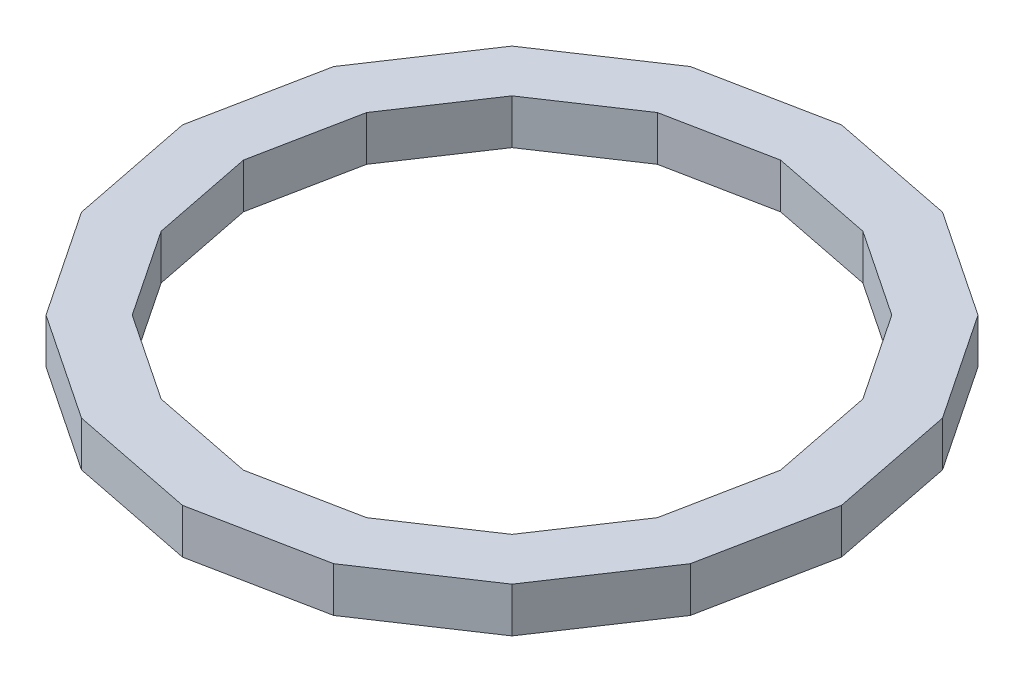
ISO-10303-21;
HEADER;
FILE_DESCRIPTION(('STEP AP214'),'2;1');
FILE_NAME('part.step','',(''),(''),'','','');
FILE_SCHEMA(('AUTOMOTIVE_DESIGN { 1 0 10303 214 1 1 1 1 }'));
ENDSEC;
DATA;
#1=APPLICATION_CONTEXT('core data for automotive mechanical design processes');
#2=APPLICATION_PROTOCOL_DEFINITION('international standard','automotive_design',2000,#1);
#3=PRODUCT_CONTEXT('',#1,'mechanical');
#4=PRODUCT('Part','Part','',(#3));
#5=PRODUCT_RELATED_PRODUCT_CATEGORY('part','',(#4));
#6=PRODUCT_DEFINITION_FORMATION('','',#4);
#7=PRODUCT_DEFINITION_CONTEXT('part definition',#1,'design');
#8=PRODUCT_DEFINITION('design','',#6,#7);
#9=PRODUCT_DEFINITION_SHAPE('','',#8);
#10=(LENGTH_UNIT() NAMED_UNIT(*) SI_UNIT(.MILLI.,.METRE.));
#11=(NAMED_UNIT(*) PLANE_ANGLE_UNIT() SI_UNIT($,.RADIAN.));
#12=(NAMED_UNIT(*) SI_UNIT($,.STERADIAN.) SOLID_ANGLE_UNIT());
#13=UNCERTAINTY_MEASURE_WITH_UNIT(LENGTH_MEASURE(1.E-05),#10,'distance_accuracy_value','');
#14=(GEOMETRIC_REPRESENTATION_CONTEXT(3) GLOBAL_UNCERTAINTY_ASSIGNED_CONTEXT((#13)) GLOBAL_UNIT_ASSIGNED_CONTEXT((#10,
#11,#12)) REPRESENTATION_CONTEXT('',''));
#15=CARTESIAN_POINT('',(0.,0.,0.));
#16=DIRECTION('',(0.,0.,1.));
#17=DIRECTION('',(1.,0.,0.));
#18=AXIS2_PLACEMENT_3D('',#15,#16,#17);
#19=CARTESIAN_POINT('',(0.,19.05,0.));
#20=DIRECTION('',(0.,1.,0.));
#21=DIRECTION('',(0.,0.,1.));
#22=AXIS2_PLACEMENT_3D('',#19,#20,#21);
#23=PLANE('',#22);
#24=DIRECTION('',(0.195090322016118,0.,-0.980785280403233));
#25=VECTOR('',#24,1.);
#26=CARTESIAN_POINT('',(129.306930115863,19.05,53.5606841628191));
#27=LINE('',#26,#25);
#28=CARTESIAN_POINT('',(129.306930115863,19.05,53.5606841628191));
#29=VERTEX_POINT('',#28);
#30=CARTESIAN_POINT('',(139.960812601164,19.05,-1.4849272094849E-12));
#31=VERTEX_POINT('',#30);
#32=EDGE_CURVE('E380',#29,#31,#27,.T.);
#33=ORIENTED_EDGE('',*,*,#32,.T.);
#34=DIRECTION('',(-0.195090322016138,0.,-0.980785280403228));
#35=VECTOR('',#34,1.);
#36=CARTESIAN_POINT('',(139.960812601164,19.05,-1.4849272094849E-12));
#37=LINE('',#36,#35);
#38=CARTESIAN_POINT('',(129.306930115862,19.05,-53.5606841628218));
#39=VERTEX_POINT('',#38);
#40=EDGE_CURVE('E384',#31,#39,#37,.T.);
#41=ORIENTED_EDGE('',*,*,#40,.T.);
#42=DIRECTION('',(-0.555570233019611,0.,-0.831469612302539));
#43=VECTOR('',#42,1.);
#44=CARTESIAN_POINT('',(129.306930115862,19.05,-53.5606841628218));
#45=LINE('',#44,#43);
#46=CARTESIAN_POINT('',(98.9672396906613,19.05,-98.9672396906635));
#47=VERTEX_POINT('',#46);
#48=EDGE_CURVE('E388',#39,#47,#45,.T.);
#49=ORIENTED_EDGE('',*,*,#48,.T.);
#50=DIRECTION('',(-0.831469612302551,0.,-0.555570233019593));
#51=VECTOR('',#50,1.);
#52=CARTESIAN_POINT('',(98.9672396906613,19.05,-98.9672396906635));
#53=LINE('',#52,#51);
#54=CARTESIAN_POINT('',(53.5606841628192,19.05,-129.306930115863));
#55=VERTEX_POINT('',#54);
#56=EDGE_CURVE('E391',#47,#55,#53,.T.);
#57=ORIENTED_EDGE('',*,*,#56,.T.);
#58=DIRECTION('',(-0.980785280403233,0.,-0.195090322016117));
#59=VECTOR('',#58,1.);
#60=CARTESIAN_POINT('',(53.5606841628192,19.05,-129.306930115863));
#61=LINE('',#60,#59);
#62=CARTESIAN_POINT('',(-1.46091989969416E-12,19.05,-139.960812601164));
#63=VERTEX_POINT('',#62);
#64=EDGE_CURVE('E394',#55,#63,#61,.T.);
#65=ORIENTED_EDGE('',*,*,#64,.T.);
#66=DIRECTION('',(-0.980785280403228,0.,0.195090322016138));
#67=VECTOR('',#66,1.);
#68=CARTESIAN_POINT('',(-1.46091989969416E-12,19.05,-139.960812601164));
#69=LINE('',#68,#67);
#70=CARTESIAN_POINT('',(-53.5606841628218,19.05,-129.306930115862));
#71=VERTEX_POINT('',#70);
#72=EDGE_CURVE('E396',#63,#71,#69,.T.);
#73=ORIENTED_EDGE('',*,*,#72,.T.);
#74=DIRECTION('',(-0.831469612302539,0.,0.555570233019611));
#75=VECTOR('',#74,1.);
#76=CARTESIAN_POINT('',(-53.5606841628218,19.05,-129.306930115862));
#77=LINE('',#76,#75);
#78=CARTESIAN_POINT('',(-98.9672396906635,19.05,-98.9672396906613));
#79=VERTEX_POINT('',#78);
#80=EDGE_CURVE('E399',#71,#79,#77,.T.);
#81=ORIENTED_EDGE('',*,*,#80,.T.);
#82=DIRECTION('',(-0.555570233019593,0.,0.831469612302551));
#83=VECTOR('',#82,1.);
#84=CARTESIAN_POINT('',(-98.9672396906635,19.05,-98.9672396906613));
#85=LINE('',#84,#83);
#86=CARTESIAN_POINT('',(-129.306930115863,19.05,-53.560684162819));
#87=VERTEX_POINT('',#86);
#88=EDGE_CURVE('E402',#79,#87,#85,.T.);
#89=ORIENTED_EDGE('',*,*,#88,.T.);
#90=DIRECTION('',(-0.195090322016118,0.,0.980785280403233));
#91=VECTOR('',#90,1.);
#92=CARTESIAN_POINT('',(-129.306930115863,19.05,-53.560684162819));
#93=LINE('',#92,#91);
#94=CARTESIAN_POINT('',(-139.960812601164,19.05,1.51193597542584E-12));
#95=VERTEX_POINT('',#94);
#96=EDGE_CURVE('E405',#87,#95,#93,.T.);
#97=ORIENTED_EDGE('',*,*,#96,.T.);
#98=DIRECTION('',(0.195090322016138,0.,0.980785280403228));
#99=VECTOR('',#98,1.);
#100=CARTESIAN_POINT('',(-139.960812601164,19.05,1.51193597542584E-12));
#101=LINE('',#100,#99);
#102=CARTESIAN_POINT('',(-129.306930115862,19.05,53.5606841628218));
#103=VERTEX_POINT('',#102);
#104=EDGE_CURVE('E408',#95,#103,#101,.T.);
#105=ORIENTED_EDGE('',*,*,#104,.T.);
#106=DIRECTION('',(0.555570233019611,0.,0.831469612302539));
#107=VECTOR('',#106,1.);
#108=CARTESIAN_POINT('',(-129.306930115862,19.05,53.5606841628218));
#109=LINE('',#108,#107);
#110=CARTESIAN_POINT('',(-98.9672396906613,19.05,98.9672396906634));
#111=VERTEX_POINT('',#110);
#112=EDGE_CURVE('E410',#103,#111,#109,.T.);
#113=ORIENTED_EDGE('',*,*,#112,.T.);
#114=DIRECTION('',(0.831469612302551,0.,0.555570233019594));
#115=VECTOR('',#114,1.);
#116=CARTESIAN_POINT('',(-98.9672396906613,19.05,98.9672396906634));
#117=LINE('',#116,#115);
#118=CARTESIAN_POINT('',(-53.560684162819,19.05,129.306930115863));
#119=VERTEX_POINT('',#118);
#120=EDGE_CURVE('E412',#111,#119,#117,.T.);
#121=ORIENTED_EDGE('',*,*,#120,.T.);
#122=DIRECTION('',(0.980785280403233,0.,0.195090322016118));
#123=VECTOR('',#122,1.);
#124=CARTESIAN_POINT('',(-53.560684162819,19.05,129.306930115863));
#125=LINE('',#124,#123);
#126=CARTESIAN_POINT('',(1.46319261822988E-12,19.05,139.960812601164));
#127=VERTEX_POINT('',#126);
#128=EDGE_CURVE('E414',#119,#127,#125,.T.);
#129=ORIENTED_EDGE('',*,*,#128,.T.);
#130=DIRECTION('',(0.980785280403228,0.,-0.195090322016138));
#131=VECTOR('',#130,1.);
#132=CARTESIAN_POINT('',(1.46319261822988E-12,19.05,139.960812601164));
#133=LINE('',#132,#131);
#134=CARTESIAN_POINT('',(53.5606841628219,19.05,129.306930115862));
#135=VERTEX_POINT('',#134);
#136=EDGE_CURVE('E416',#127,#135,#133,.T.);
#137=ORIENTED_EDGE('',*,*,#136,.T.);
#138=DIRECTION('',(0.831469612302539,0.,-0.555570233019611));
#139=VECTOR('',#138,1.);
#140=CARTESIAN_POINT('',(53.5606841628219,19.05,129.306930115862));
#141=LINE('',#140,#139);
#142=CARTESIAN_POINT('',(98.9672396906635,19.05,98.9672396906613));
#143=VERTEX_POINT('',#142);
#144=EDGE_CURVE('E418',#135,#143,#141,.T.);
#145=ORIENTED_EDGE('',*,*,#144,.T.);
#146=DIRECTION('',(0.555570233019594,0.,-0.831469612302551));
#147=VECTOR('',#146,1.);
#148=CARTESIAN_POINT('',(98.9672396906635,19.05,98.9672396906613));
#149=LINE('',#148,#147);
#150=EDGE_CURVE('E421',#143,#29,#149,.T.);
#151=ORIENTED_EDGE('',*,*,#150,.T.);
#152=EDGE_LOOP('',(#33,#41,#49,#57,#65,#73,#81,#89,#97,#105,#113,#121,#129,#137,#145,#151));
#153=FACE_BOUND('',#152,.T.);
#154=DIRECTION('',(-0.195090322016138,0.,-0.980785280403228));
#155=VECTOR('',#154,1.);
#156=CARTESIAN_POINT('',(114.063197182672,19.05,-1.20281978299637E-12));
#157=LINE('',#156,#155);
#158=CARTESIAN_POINT('',(114.063197182672,19.05,-1.20281978299637E-12));
#159=VERTEX_POINT('',#158);
#160=CARTESIAN_POINT('',(105.38065328987,19.05,-43.6500958044022));
#161=VERTEX_POINT('',#160);
#162=EDGE_CURVE('E253',#159,#161,#157,.T.);
#163=ORIENTED_EDGE('',*,*,#162,.F.);
#164=DIRECTION('',(0.195090322016118,0.,-0.980785280403232));
#165=VECTOR('',#164,1.);
#166=CARTESIAN_POINT('',(105.380653289871,19.05,43.6500958043999));
#167=LINE('',#166,#165);
#168=CARTESIAN_POINT('',(105.380653289871,19.05,43.6500958043999));
#169=VERTEX_POINT('',#168);
#170=EDGE_CURVE('E244',#169,#159,#167,.T.);
#171=ORIENTED_EDGE('',*,*,#170,.F.);
#172=DIRECTION('',(0.555570233019593,0.,-0.831469612302551));
#173=VECTOR('',#172,1.);
#174=CARTESIAN_POINT('',(80.6548602116868,19.05,80.654860211685));
#175=LINE('',#174,#173);
#176=CARTESIAN_POINT('',(80.6548602116868,19.05,80.654860211685));
#177=VERTEX_POINT('',#176);
#178=EDGE_CURVE('E302',#177,#169,#175,.T.);
#179=ORIENTED_EDGE('',*,*,#178,.F.);
#180=DIRECTION('',(0.831469612302539,0.,-0.555570233019611));
#181=VECTOR('',#180,1.);
#182=CARTESIAN_POINT('',(43.6500958044022,19.05,105.38065328987));
#183=LINE('',#182,#181);
#184=CARTESIAN_POINT('',(43.6500958044022,19.05,105.38065328987));
#185=VERTEX_POINT('',#184);
#186=EDGE_CURVE('E300',#185,#177,#183,.T.);
#187=ORIENTED_EDGE('',*,*,#186,.F.);
#188=DIRECTION('',(0.980785280403228,0.,-0.195090322016139));
#189=VECTOR('',#188,1.);
#190=CARTESIAN_POINT('',(1.23146396248173E-12,19.05,114.063197182672));
#191=LINE('',#190,#189);
#192=CARTESIAN_POINT('',(1.23146396248173E-12,19.05,114.063197182672));
#193=VERTEX_POINT('',#192);
#194=EDGE_CURVE('E298',#193,#185,#191,.T.);
#195=ORIENTED_EDGE('',*,*,#194,.F.);
#196=DIRECTION('',(0.980785280403232,0.,0.195090322016118));
#197=VECTOR('',#196,1.);
#198=CARTESIAN_POINT('',(-43.6500958043999,19.05,105.38065328987));
#199=LINE('',#198,#197);
#200=CARTESIAN_POINT('',(-43.6500958043999,19.05,105.38065328987));
#201=VERTEX_POINT('',#200);
#202=EDGE_CURVE('E296',#201,#193,#199,.T.);
#203=ORIENTED_EDGE('',*,*,#202,.F.);
#204=DIRECTION('',(0.831469612302551,0.,0.555570233019593));
#205=VECTOR('',#204,1.);
#206=CARTESIAN_POINT('',(-80.6548602116851,19.05,80.6548602116867));
#207=LINE('',#206,#205);
#208=CARTESIAN_POINT('',(-80.6548602116851,19.05,80.6548602116867));
#209=VERTEX_POINT('',#208);
#210=EDGE_CURVE('E294',#209,#201,#207,.T.);
#211=ORIENTED_EDGE('',*,*,#210,.F.);
#212=DIRECTION('',(0.555570233019611,0.,0.831469612302539));
#213=VECTOR('',#212,1.);
#214=CARTESIAN_POINT('',(-105.38065328987,19.05,43.6500958044023));
#215=LINE('',#214,#213);
#216=CARTESIAN_POINT('',(-105.38065328987,19.05,43.6500958044023));
#217=VERTEX_POINT('',#216);
#218=EDGE_CURVE('E292',#217,#209,#215,.T.);
#219=ORIENTED_EDGE('',*,*,#218,.F.);
#220=DIRECTION('',(0.195090322016138,0.,0.980785280403228));
#221=VECTOR('',#220,1.);
#222=CARTESIAN_POINT('',(-114.063197182672,19.05,1.20319742606453E-12));
#223=LINE('',#222,#221);
#224=CARTESIAN_POINT('',(-114.063197182672,19.05,1.20319742606453E-12));
#225=VERTEX_POINT('',#224);
#226=EDGE_CURVE('E290',#225,#217,#223,.T.);
#227=ORIENTED_EDGE('',*,*,#226,.F.);
#228=DIRECTION('',(-0.195090322016118,0.,0.980785280403233));
#229=VECTOR('',#228,1.);
#230=CARTESIAN_POINT('',(-105.38065328987,19.05,-43.6500958043999));
#231=LINE('',#230,#229);
#232=CARTESIAN_POINT('',(-105.38065328987,19.05,-43.6500958043999));
#233=VERTEX_POINT('',#232);
#234=EDGE_CURVE('E288',#233,#225,#231,.T.);
#235=ORIENTED_EDGE('',*,*,#234,.F.);
#236=DIRECTION('',(-0.555570233019593,0.,0.831469612302552));
#237=VECTOR('',#236,1.);
#238=CARTESIAN_POINT('',(-80.6548602116868,19.05,-80.654860211685));
#239=LINE('',#238,#237);
#240=CARTESIAN_POINT('',(-80.6548602116868,19.05,-80.654860211685));
#241=VERTEX_POINT('',#240);
#242=EDGE_CURVE('E285',#241,#233,#239,.T.);
#243=ORIENTED_EDGE('',*,*,#242,.F.);
#244=DIRECTION('',(-0.831469612302539,0.,0.555570233019611));
#245=VECTOR('',#244,1.);
#246=CARTESIAN_POINT('',(-43.6500958044022,19.05,-105.38065328987));
#247=LINE('',#246,#245);
#248=CARTESIAN_POINT('',(-43.6500958044022,19.05,-105.38065328987));
#249=VERTEX_POINT('',#248);
#250=EDGE_CURVE('E282',#249,#241,#247,.T.);
#251=ORIENTED_EDGE('',*,*,#250,.F.);
#252=DIRECTION('',(-0.980785280403228,0.,0.195090322016139));
#253=VECTOR('',#252,1.);
#254=CARTESIAN_POINT('',(-1.31730632398808E-12,19.05,-114.063197182672));
#255=LINE('',#254,#253);
#256=CARTESIAN_POINT('',(-1.31730632398808E-12,19.05,-114.063197182672));
#257=VERTEX_POINT('',#256);
#258=EDGE_CURVE('E280',#257,#249,#255,.T.);
#259=ORIENTED_EDGE('',*,*,#258,.F.);
#260=DIRECTION('',(-0.980785280403233,0.,-0.195090322016117));
#261=VECTOR('',#260,1.);
#262=CARTESIAN_POINT('',(43.6500958044,19.05,-105.38065328987));
#263=LINE('',#262,#261);
#264=CARTESIAN_POINT('',(43.6500958044,19.05,-105.38065328987));
#265=VERTEX_POINT('',#264);
#266=EDGE_CURVE('E277',#265,#257,#263,.T.);
#267=ORIENTED_EDGE('',*,*,#266,.F.);
#268=DIRECTION('',(-0.831469612302551,0.,-0.555570233019593));
#269=VECTOR('',#268,1.);
#270=CARTESIAN_POINT('',(80.6548602116851,19.05,-80.6548602116868));
#271=LINE('',#270,#269);
#272=CARTESIAN_POINT('',(80.6548602116851,19.05,-80.6548602116868));
#273=VERTEX_POINT('',#272);
#274=EDGE_CURVE('E273',#273,#265,#271,.T.);
#275=ORIENTED_EDGE('',*,*,#274,.F.);
#276=DIRECTION('',(-0.555570233019611,0.,-0.831469612302539));
#277=VECTOR('',#276,1.);
#278=CARTESIAN_POINT('',(105.38065328987,19.05,-43.6500958044022));
#279=LINE('',#278,#277);
#280=EDGE_CURVE('E266',#161,#273,#279,.T.);
#281=ORIENTED_EDGE('',*,*,#280,.F.);
#282=EDGE_LOOP('',(#163,#171,#179,#187,#195,#203,#211,#219,#227,#235,#243,#251,#259,#267,#275,#281));
#283=FACE_BOUND('',#282,.T.);
#284=ADVANCED_FACE('F35',(#153,#283),#23,.T.);
#285=CARTESIAN_POINT('',(0.,0.,0.));
#286=DIRECTION('',(0.,1.,0.));
#287=DIRECTION('',(0.,0.,1.));
#288=AXIS2_PLACEMENT_3D('',#285,#286,#287);
#289=PLANE('',#288);
#290=DIRECTION('',(0.195090322016118,0.,-0.980785280403233));
#291=VECTOR('',#290,1.);
#292=CARTESIAN_POINT('',(129.306930115863,0.,53.5606841628191));
#293=LINE('',#292,#291);
#294=CARTESIAN_POINT('',(129.306930115863,0.,53.5606841628191));
#295=VERTEX_POINT('',#294);
#296=CARTESIAN_POINT('',(139.960812601164,0.,-1.4849272094849E-12));
#297=VERTEX_POINT('',#296);
#298=EDGE_CURVE('E261',#295,#297,#293,.T.);
#299=ORIENTED_EDGE('',*,*,#298,.F.);
#300=DIRECTION('',(0.555570233019594,0.,-0.831469612302551));
#301=VECTOR('',#300,1.);
#302=CARTESIAN_POINT('',(98.9672396906635,0.,98.9672396906613));
#303=LINE('',#302,#301);
#304=CARTESIAN_POINT('',(98.9672396906635,0.,98.9672396906613));
#305=VERTEX_POINT('',#304);
#306=EDGE_CURVE('E385',#305,#295,#303,.T.);
#307=ORIENTED_EDGE('',*,*,#306,.F.);
#308=DIRECTION('',(0.831469612302539,0.,-0.555570233019611));
#309=VECTOR('',#308,1.);
#310=CARTESIAN_POINT('',(53.5606841628219,0.,129.306930115862));
#311=LINE('',#310,#309);
#312=CARTESIAN_POINT('',(53.5606841628219,0.,129.306930115862));
#313=VERTEX_POINT('',#312);
#314=EDGE_CURVE('E457',#313,#305,#311,.T.);
#315=ORIENTED_EDGE('',*,*,#314,.F.);
#316=DIRECTION('',(0.980785280403228,0.,-0.195090322016138));
#317=VECTOR('',#316,1.);
#318=CARTESIAN_POINT('',(1.46319261822988E-12,0.,139.960812601164));
#319=LINE('',#318,#317);
#320=CARTESIAN_POINT('',(1.46319261822988E-12,0.,139.960812601164));
#321=VERTEX_POINT('',#320);
#322=EDGE_CURVE('E455',#321,#313,#319,.T.);
#323=ORIENTED_EDGE('',*,*,#322,.F.);
#324=DIRECTION('',(0.980785280403233,0.,0.195090322016118));
#325=VECTOR('',#324,1.);
#326=CARTESIAN_POINT('',(-53.560684162819,0.,129.306930115863));
#327=LINE('',#326,#325);
#328=CARTESIAN_POINT('',(-53.560684162819,0.,129.306930115863));
#329=VERTEX_POINT('',#328);
#330=EDGE_CURVE('E452',#329,#321,#327,.T.);
#331=ORIENTED_EDGE('',*,*,#330,.F.);
#332=DIRECTION('',(0.831469612302551,0.,0.555570233019594));
#333=VECTOR('',#332,1.);
#334=CARTESIAN_POINT('',(-98.9672396906613,0.,98.9672396906634));
#335=LINE('',#334,#333);
#336=CARTESIAN_POINT('',(-98.9672396906613,0.,98.9672396906634));
#337=VERTEX_POINT('',#336);
#338=EDGE_CURVE('E449',#337,#329,#335,.T.);
#339=ORIENTED_EDGE('',*,*,#338,.F.);
#340=DIRECTION('',(0.555570233019611,0.,0.831469612302539));
#341=VECTOR('',#340,1.);
#342=CARTESIAN_POINT('',(-129.306930115862,0.,53.5606841628218));
#343=LINE('',#342,#341);
#344=CARTESIAN_POINT('',(-129.306930115862,0.,53.5606841628218));
#345=VERTEX_POINT('',#344);
#346=EDGE_CURVE('E446',#345,#337,#343,.T.);
#347=ORIENTED_EDGE('',*,*,#346,.F.);
#348=DIRECTION('',(0.195090322016138,0.,0.980785280403228));
#349=VECTOR('',#348,1.);
#350=CARTESIAN_POINT('',(-139.960812601164,0.,1.51193597542584E-12));
#351=LINE('',#350,#349);
#352=CARTESIAN_POINT('',(-139.960812601164,0.,1.51193597542584E-12));
#353=VERTEX_POINT('',#352);
#354=EDGE_CURVE('E444',#353,#345,#351,.T.);
#355=ORIENTED_EDGE('',*,*,#354,.F.);
#356=DIRECTION('',(-0.195090322016118,0.,0.980785280403233));
#357=VECTOR('',#356,1.);
#358=CARTESIAN_POINT('',(-129.306930115863,0.,-53.560684162819));
#359=LINE('',#358,#357);
#360=CARTESIAN_POINT('',(-129.306930115863,0.,-53.560684162819));
#361=VERTEX_POINT('',#360);
#362=EDGE_CURVE('E442',#361,#353,#359,.T.);
#363=ORIENTED_EDGE('',*,*,#362,.F.);
#364=DIRECTION('',(-0.555570233019593,0.,0.831469612302551));
#365=VECTOR('',#364,1.);
#366=CARTESIAN_POINT('',(-98.9672396906635,0.,-98.9672396906613));
#367=LINE('',#366,#365);
#368=CARTESIAN_POINT('',(-98.9672396906635,0.,-98.9672396906613));
#369=VERTEX_POINT('',#368);
#370=EDGE_CURVE('E439',#369,#361,#367,.T.);
#371=ORIENTED_EDGE('',*,*,#370,.F.);
#372=DIRECTION('',(-0.831469612302539,0.,0.555570233019611));
#373=VECTOR('',#372,1.);
#374=CARTESIAN_POINT('',(-53.5606841628218,0.,-129.306930115862));
#375=LINE('',#374,#373);
#376=CARTESIAN_POINT('',(-53.5606841628218,0.,-129.306930115862));
#377=VERTEX_POINT('',#376);
#378=EDGE_CURVE('E437',#377,#369,#375,.T.);
#379=ORIENTED_EDGE('',*,*,#378,.F.);
#380=DIRECTION('',(-0.980785280403228,0.,0.195090322016138));
#381=VECTOR('',#380,1.);
#382=CARTESIAN_POINT('',(-1.46091989969416E-12,0.,-139.960812601164));
#383=LINE('',#382,#381);
#384=CARTESIAN_POINT('',(-1.46091989969416E-12,0.,-139.960812601164));
#385=VERTEX_POINT('',#384);
#386=EDGE_CURVE('E435',#385,#377,#383,.T.);
#387=ORIENTED_EDGE('',*,*,#386,.F.);
#388=DIRECTION('',(-0.980785280403233,0.,-0.195090322016117));
#389=VECTOR('',#388,1.);
#390=CARTESIAN_POINT('',(53.5606841628192,0.,-129.306930115863));
#391=LINE('',#390,#389);
#392=CARTESIAN_POINT('',(53.5606841628192,0.,-129.306930115863));
#393=VERTEX_POINT('',#392);
#394=EDGE_CURVE('E433',#393,#385,#391,.T.);
#395=ORIENTED_EDGE('',*,*,#394,.F.);
#396=DIRECTION('',(-0.831469612302551,0.,-0.555570233019593));
#397=VECTOR('',#396,1.);
#398=CARTESIAN_POINT('',(98.9672396906613,0.,-98.9672396906635));
#399=LINE('',#398,#397);
#400=CARTESIAN_POINT('',(98.9672396906613,0.,-98.9672396906635));
#401=VERTEX_POINT('',#400);
#402=EDGE_CURVE('E431',#401,#393,#399,.T.);
#403=ORIENTED_EDGE('',*,*,#402,.F.);
#404=DIRECTION('',(-0.555570233019611,0.,-0.831469612302539));
#405=VECTOR('',#404,1.);
#406=CARTESIAN_POINT('',(129.306930115862,0.,-53.5606841628218));
#407=LINE('',#406,#405);
#408=CARTESIAN_POINT('',(129.306930115862,0.,-53.5606841628218));
#409=VERTEX_POINT('',#408);
#410=EDGE_CURVE('E428',#409,#401,#407,.T.);
#411=ORIENTED_EDGE('',*,*,#410,.F.);
#412=DIRECTION('',(-0.195090322016138,0.,-0.980785280403228));
#413=VECTOR('',#412,1.);
#414=CARTESIAN_POINT('',(139.960812601164,0.,-1.4849272094849E-12));
#415=LINE('',#414,#413);
#416=EDGE_CURVE('E426',#297,#409,#415,.T.);
#417=ORIENTED_EDGE('',*,*,#416,.F.);
#418=EDGE_LOOP('',(#299,#307,#315,#323,#331,#339,#347,#355,#363,#371,#379,#387,#395,#403,#411,#417));
#419=FACE_BOUND('',#418,.T.);
#420=DIRECTION('',(0.195090322016118,0.,-0.980785280403232));
#421=VECTOR('',#420,1.);
#422=CARTESIAN_POINT('',(105.380653289871,0.,43.6500958043999));
#423=LINE('',#422,#421);
#424=CARTESIAN_POINT('',(105.380653289871,0.,43.6500958043999));
#425=VERTEX_POINT('',#424);
#426=CARTESIAN_POINT('',(114.063197182672,0.,-1.20281978299637E-12));
#427=VERTEX_POINT('',#426);
#428=EDGE_CURVE('E58',#425,#427,#423,.T.);
#429=ORIENTED_EDGE('',*,*,#428,.T.);
#430=DIRECTION('',(-0.195090322016138,0.,-0.980785280403228));
#431=VECTOR('',#430,1.);
#432=CARTESIAN_POINT('',(114.063197182672,0.,-1.20281978299637E-12));
#433=LINE('',#432,#431);
#434=CARTESIAN_POINT('',(105.38065328987,0.,-43.6500958044022));
#435=VERTEX_POINT('',#434);
#436=EDGE_CURVE('E260',#427,#435,#433,.T.);
#437=ORIENTED_EDGE('',*,*,#436,.T.);
#438=DIRECTION('',(-0.555570233019611,0.,-0.831469612302539));
#439=VECTOR('',#438,1.);
#440=CARTESIAN_POINT('',(105.38065328987,0.,-43.6500958044022));
#441=LINE('',#440,#439);
#442=CARTESIAN_POINT('',(80.6548602116851,0.,-80.6548602116868));
#443=VERTEX_POINT('',#442);
#444=EDGE_CURVE('E308',#435,#443,#441,.T.);
#445=ORIENTED_EDGE('',*,*,#444,.T.);
#446=DIRECTION('',(-0.831469612302551,0.,-0.555570233019593));
#447=VECTOR('',#446,1.);
#448=CARTESIAN_POINT('',(80.6548602116851,0.,-80.6548602116868));
#449=LINE('',#448,#447);
#450=CARTESIAN_POINT('',(43.6500958044,0.,-105.38065328987));
#451=VERTEX_POINT('',#450);
#452=EDGE_CURVE('E312',#443,#451,#449,.T.);
#453=ORIENTED_EDGE('',*,*,#452,.T.);
#454=DIRECTION('',(-0.980785280403233,0.,-0.195090322016117));
#455=VECTOR('',#454,1.);
#456=CARTESIAN_POINT('',(43.6500958044,0.,-105.38065328987));
#457=LINE('',#456,#455);
#458=CARTESIAN_POINT('',(-1.31730632398808E-12,0.,-114.063197182672));
#459=VERTEX_POINT('',#458);
#460=EDGE_CURVE('E315',#451,#459,#457,.T.);
#461=ORIENTED_EDGE('',*,*,#460,.T.);
#462=DIRECTION('',(-0.980785280403228,0.,0.195090322016139));
#463=VECTOR('',#462,1.);
#464=CARTESIAN_POINT('',(-1.31730632398808E-12,0.,-114.063197182672));
#465=LINE('',#464,#463);
#466=CARTESIAN_POINT('',(-43.6500958044022,0.,-105.38065328987));
#467=VERTEX_POINT('',#466);
#468=EDGE_CURVE('E318',#459,#467,#465,.T.);
#469=ORIENTED_EDGE('',*,*,#468,.T.);
#470=DIRECTION('',(-0.831469612302539,0.,0.555570233019611));
#471=VECTOR('',#470,1.);
#472=CARTESIAN_POINT('',(-43.6500958044022,0.,-105.38065328987));
#473=LINE('',#472,#471);
#474=CARTESIAN_POINT('',(-80.6548602116868,0.,-80.654860211685));
#475=VERTEX_POINT('',#474);
#476=EDGE_CURVE('E321',#467,#475,#473,.T.);
#477=ORIENTED_EDGE('',*,*,#476,.T.);
#478=DIRECTION('',(-0.555570233019593,0.,0.831469612302552));
#479=VECTOR('',#478,1.);
#480=CARTESIAN_POINT('',(-80.6548602116868,0.,-80.654860211685));
#481=LINE('',#480,#479);
#482=CARTESIAN_POINT('',(-105.38065328987,0.,-43.6500958043999));
#483=VERTEX_POINT('',#482);
#484=EDGE_CURVE('E324',#475,#483,#481,.T.);
#485=ORIENTED_EDGE('',*,*,#484,.T.);
#486=DIRECTION('',(-0.195090322016118,0.,0.980785280403233));
#487=VECTOR('',#486,1.);
#488=CARTESIAN_POINT('',(-105.38065328987,0.,-43.6500958043999));
#489=LINE('',#488,#487);
#490=CARTESIAN_POINT('',(-114.063197182672,0.,1.20319742606453E-12));
#491=VERTEX_POINT('',#490);
#492=EDGE_CURVE('E328',#483,#491,#489,.T.);
#493=ORIENTED_EDGE('',*,*,#492,.T.);
#494=DIRECTION('',(0.195090322016138,0.,0.980785280403228));
#495=VECTOR('',#494,1.);
#496=CARTESIAN_POINT('',(-114.063197182672,0.,1.20319742606453E-12));
#497=LINE('',#496,#495);
#498=CARTESIAN_POINT('',(-105.38065328987,0.,43.6500958044023));
#499=VERTEX_POINT('',#498);
#500=EDGE_CURVE('E331',#491,#499,#497,.T.);
#501=ORIENTED_EDGE('',*,*,#500,.T.);
#502=DIRECTION('',(0.555570233019611,0.,0.831469612302539));
#503=VECTOR('',#502,1.);
#504=CARTESIAN_POINT('',(-105.38065328987,0.,43.6500958044023));
#505=LINE('',#504,#503);
#506=CARTESIAN_POINT('',(-80.6548602116851,0.,80.6548602116867));
#507=VERTEX_POINT('',#506);
#508=EDGE_CURVE('E334',#499,#507,#505,.T.);
#509=ORIENTED_EDGE('',*,*,#508,.T.);
#510=DIRECTION('',(0.831469612302551,0.,0.555570233019593));
#511=VECTOR('',#510,1.);
#512=CARTESIAN_POINT('',(-80.6548602116851,0.,80.6548602116867));
#513=LINE('',#512,#511);
#514=CARTESIAN_POINT('',(-43.6500958043999,0.,105.38065328987));
#515=VERTEX_POINT('',#514);
#516=EDGE_CURVE('E337',#507,#515,#513,.T.);
#517=ORIENTED_EDGE('',*,*,#516,.T.);
#518=DIRECTION('',(0.980785280403232,0.,0.195090322016118));
#519=VECTOR('',#518,1.);
#520=CARTESIAN_POINT('',(-43.6500958043999,0.,105.38065328987));
#521=LINE('',#520,#519);
#522=CARTESIAN_POINT('',(1.23146396248173E-12,0.,114.063197182672));
#523=VERTEX_POINT('',#522);
#524=EDGE_CURVE('E340',#515,#523,#521,.T.);
#525=ORIENTED_EDGE('',*,*,#524,.T.);
#526=DIRECTION('',(0.980785280403228,0.,-0.195090322016139));
#527=VECTOR('',#526,1.);
#528=CARTESIAN_POINT('',(1.23146396248173E-12,0.,114.063197182672));
#529=LINE('',#528,#527);
#530=CARTESIAN_POINT('',(43.6500958044022,0.,105.38065328987));
#531=VERTEX_POINT('',#530);
#532=EDGE_CURVE('E343',#523,#531,#529,.T.);
#533=ORIENTED_EDGE('',*,*,#532,.T.);
#534=DIRECTION('',(0.831469612302539,0.,-0.555570233019611));
#535=VECTOR('',#534,1.);
#536=CARTESIAN_POINT('',(43.6500958044022,0.,105.38065328987));
#537=LINE('',#536,#535);
#538=CARTESIAN_POINT('',(80.6548602116868,0.,80.654860211685));
#539=VERTEX_POINT('',#538);
#540=EDGE_CURVE('E346',#531,#539,#537,.T.);
#541=ORIENTED_EDGE('',*,*,#540,.T.);
#542=DIRECTION('',(0.555570233019593,0.,-0.831469612302551));
#543=VECTOR('',#542,1.);
#544=CARTESIAN_POINT('',(80.6548602116868,0.,80.654860211685));
#545=LINE('',#544,#543);
#546=EDGE_CURVE('E254',#539,#425,#545,.T.);
#547=ORIENTED_EDGE('',*,*,#546,.T.);
#548=EDGE_LOOP('',(#429,#437,#445,#453,#461,#469,#477,#485,#493,#501,#509,#517,#525,#533,#541,#547));
#549=FACE_BOUND('',#548,.T.);
#550=ADVANCED_FACE('F515',(#419,#549),#289,.F.);
#551=CARTESIAN_POINT('',(129.306930115863,19.05,53.5606841628191));
#552=DIRECTION('',(-0.980785280403233,0.,-0.195090322016118));
#553=DIRECTION('',(-0.195090322016118,0.,0.980785280403233));
#554=AXIS2_PLACEMENT_3D('',#551,#552,#553);
#555=PLANE('',#554);
#556=ORIENTED_EDGE('',*,*,#298,.T.);
#557=DIRECTION('',(0.,-1.,0.));
#558=VECTOR('',#557,1.);
#559=CARTESIAN_POINT('',(139.960812601164,19.05,-1.4849272094849E-12));
#560=LINE('',#559,#558);
#561=EDGE_CURVE('E11',#31,#297,#560,.T.);
#562=ORIENTED_EDGE('',*,*,#561,.F.);
#563=ORIENTED_EDGE('',*,*,#32,.F.);
#564=DIRECTION('',(0.,-1.,0.));
#565=VECTOR('',#564,1.);
#566=CARTESIAN_POINT('',(129.306930115863,19.05,53.5606841628191));
#567=LINE('',#566,#565);
#568=EDGE_CURVE('E423',#29,#295,#567,.T.);
#569=ORIENTED_EDGE('',*,*,#568,.T.);
#570=EDGE_LOOP('',(#556,#562,#563,#569));
#571=FACE_BOUND('',#570,.T.);
#572=ADVANCED_FACE('F37',(#571),#555,.F.);
#573=CARTESIAN_POINT('',(139.960812601164,19.05,-1.4849272094849E-12));
#574=DIRECTION('',(-0.980785280403228,0.,0.195090322016138));
#575=DIRECTION('',(0.195090322016138,0.,0.980785280403229));
#576=AXIS2_PLACEMENT_3D('',#573,#574,#575);
#577=PLANE('',#576);
#578=ORIENTED_EDGE('',*,*,#416,.T.);
#579=DIRECTION('',(0.,-1.,0.));
#580=VECTOR('',#579,1.);
#581=CARTESIAN_POINT('',(129.306930115862,19.05,-53.5606841628218));
#582=LINE('',#581,#580);
#583=EDGE_CURVE('E43',#39,#409,#582,.T.);
#584=ORIENTED_EDGE('',*,*,#583,.F.);
#585=ORIENTED_EDGE('',*,*,#40,.F.);
#586=ORIENTED_EDGE('',*,*,#561,.T.);
#587=EDGE_LOOP('',(#578,#584,#585,#586));
#588=FACE_BOUND('',#587,.T.);
#589=ADVANCED_FACE('F532',(#588),#577,.F.);
#590=CARTESIAN_POINT('',(129.306930115862,19.05,-53.5606841628218));
#591=DIRECTION('',(-0.831469612302539,0.,0.555570233019611));
#592=DIRECTION('',(0.555570233019611,0.,0.831469612302539));
#593=AXIS2_PLACEMENT_3D('',#590,#591,#592);
#594=PLANE('',#593);
#595=ORIENTED_EDGE('',*,*,#410,.T.);
#596=DIRECTION('',(0.,-1.,0.));
#597=VECTOR('',#596,1.);
#598=CARTESIAN_POINT('',(98.9672396906613,19.05,-98.9672396906635));
#599=LINE('',#598,#597);
#600=EDGE_CURVE('E502',#47,#401,#599,.T.);
#601=ORIENTED_EDGE('',*,*,#600,.F.);
#602=ORIENTED_EDGE('',*,*,#48,.F.);
#603=ORIENTED_EDGE('',*,*,#583,.T.);
#604=EDGE_LOOP('',(#595,#601,#602,#603));
#605=FACE_BOUND('',#604,.T.);
#606=ADVANCED_FACE('F509',(#605),#594,.F.);
#607=CARTESIAN_POINT('',(98.9672396906613,19.05,-98.9672396906635));
#608=DIRECTION('',(-0.555570233019594,0.,0.831469612302551));
#609=DIRECTION('',(0.831469612302551,0.,0.555570233019594));
#610=AXIS2_PLACEMENT_3D('',#607,#608,#609);
#611=PLANE('',#610);
#612=ORIENTED_EDGE('',*,*,#402,.T.);
#613=DIRECTION('',(0.,-1.,0.));
#614=VECTOR('',#613,1.);
#615=CARTESIAN_POINT('',(53.5606841628192,19.05,-129.306930115863));
#616=LINE('',#615,#614);
#617=EDGE_CURVE('E499',#55,#393,#616,.T.);
#618=ORIENTED_EDGE('',*,*,#617,.F.);
#619=ORIENTED_EDGE('',*,*,#56,.F.);
#620=ORIENTED_EDGE('',*,*,#600,.T.);
#621=EDGE_LOOP('',(#612,#618,#619,#620));
#622=FACE_BOUND('',#621,.T.);
#623=ADVANCED_FACE('F521',(#622),#611,.F.);
#624=CARTESIAN_POINT('',(53.5606841628192,19.05,-129.306930115863));
#625=DIRECTION('',(-0.195090322016117,0.,0.980785280403233));
#626=DIRECTION('',(0.980785280403233,0.,0.195090322016117));
#627=AXIS2_PLACEMENT_3D('',#624,#625,#626);
#628=PLANE('',#627);
#629=ORIENTED_EDGE('',*,*,#394,.T.);
#630=DIRECTION('',(0.,-1.,0.));
#631=VECTOR('',#630,1.);
#632=CARTESIAN_POINT('',(-1.46091989969416E-12,19.05,-139.960812601164));
#633=LINE('',#632,#631);
#634=EDGE_CURVE('E495',#63,#385,#633,.T.);
#635=ORIENTED_EDGE('',*,*,#634,.F.);
#636=ORIENTED_EDGE('',*,*,#64,.F.);
#637=ORIENTED_EDGE('',*,*,#617,.T.);
#638=EDGE_LOOP('',(#629,#635,#636,#637));
#639=FACE_BOUND('',#638,.T.);
#640=ADVANCED_FACE('F525',(#639),#628,.F.);
#641=CARTESIAN_POINT('',(-1.46091989969416E-12,19.05,-139.960812601164));
#642=DIRECTION('',(0.195090322016138,0.,0.980785280403228));
#643=DIRECTION('',(0.980785280403229,0.,-0.195090322016139));
#644=AXIS2_PLACEMENT_3D('',#641,#642,#643);
#645=PLANE('',#644);
#646=ORIENTED_EDGE('',*,*,#386,.T.);
#647=DIRECTION('',(0.,-1.,0.));
#648=VECTOR('',#647,1.);
#649=CARTESIAN_POINT('',(-53.5606841628218,19.05,-129.306930115862));
#650=LINE('',#649,#648);
#651=EDGE_CURVE('E491',#71,#377,#650,.T.);
#652=ORIENTED_EDGE('',*,*,#651,.F.);
#653=ORIENTED_EDGE('',*,*,#72,.F.);
#654=ORIENTED_EDGE('',*,*,#634,.T.);
#655=EDGE_LOOP('',(#646,#652,#653,#654));
#656=FACE_BOUND('',#655,.T.);
#657=ADVANCED_FACE('F585',(#656),#645,.F.);
#658=CARTESIAN_POINT('',(-53.5606841628218,19.05,-129.306930115862));
#659=DIRECTION('',(0.555570233019611,0.,0.831469612302539));
#660=DIRECTION('',(0.831469612302539,0.,-0.555570233019611));
#661=AXIS2_PLACEMENT_3D('',#658,#659,#660);
#662=PLANE('',#661);
#663=ORIENTED_EDGE('',*,*,#378,.T.);
#664=DIRECTION('',(0.,-1.,0.));
#665=VECTOR('',#664,1.);
#666=CARTESIAN_POINT('',(-98.9672396906635,19.05,-98.9672396906613));
#667=LINE('',#666,#665);
#668=EDGE_CURVE('E488',#79,#369,#667,.T.);
#669=ORIENTED_EDGE('',*,*,#668,.F.);
#670=ORIENTED_EDGE('',*,*,#80,.F.);
#671=ORIENTED_EDGE('',*,*,#651,.T.);
#672=EDGE_LOOP('',(#663,#669,#670,#671));
#673=FACE_BOUND('',#672,.T.);
#674=ADVANCED_FACE('F582',(#673),#662,.F.);
#675=CARTESIAN_POINT('',(-98.9672396906635,19.05,-98.9672396906613));
#676=DIRECTION('',(0.831469612302551,0.,0.555570233019593));
#677=DIRECTION('',(0.555570233019593,0.,-0.831469612302551));
#678=AXIS2_PLACEMENT_3D('',#675,#676,#677);
#679=PLANE('',#678);
#680=ORIENTED_EDGE('',*,*,#370,.T.);
#681=DIRECTION('',(0.,-1.,0.));
#682=VECTOR('',#681,1.);
#683=CARTESIAN_POINT('',(-129.306930115863,19.05,-53.560684162819));
#684=LINE('',#683,#682);
#685=EDGE_CURVE('E484',#87,#361,#684,.T.);
#686=ORIENTED_EDGE('',*,*,#685,.F.);
#687=ORIENTED_EDGE('',*,*,#88,.F.);
#688=ORIENTED_EDGE('',*,*,#668,.T.);
#689=EDGE_LOOP('',(#680,#686,#687,#688));
#690=FACE_BOUND('',#689,.T.);
#691=ADVANCED_FACE('F578',(#690),#679,.F.);
#692=CARTESIAN_POINT('',(-129.306930115863,19.05,-53.560684162819));
#693=DIRECTION('',(0.980785280403233,0.,0.195090322016118));
#694=DIRECTION('',(0.195090322016118,0.,-0.980785280403233));
#695=AXIS2_PLACEMENT_3D('',#692,#693,#694);
#696=PLANE('',#695);
#697=ORIENTED_EDGE('',*,*,#362,.T.);
#698=DIRECTION('',(0.,-1.,0.));
#699=VECTOR('',#698,1.);
#700=CARTESIAN_POINT('',(-139.960812601164,19.05,1.51193597542584E-12));
#701=LINE('',#700,#699);
#702=EDGE_CURVE('E481',#95,#353,#701,.T.);
#703=ORIENTED_EDGE('',*,*,#702,.F.);
#704=ORIENTED_EDGE('',*,*,#96,.F.);
#705=ORIENTED_EDGE('',*,*,#685,.T.);
#706=EDGE_LOOP('',(#697,#703,#704,#705));
#707=FACE_BOUND('',#706,.T.);
#708=ADVANCED_FACE('F574',(#707),#696,.F.);
#709=CARTESIAN_POINT('',(-139.960812601164,19.05,1.51193597542584E-12));
#710=DIRECTION('',(0.980785280403228,0.,-0.195090322016138));
#711=DIRECTION('',(-0.195090322016138,0.,-0.980785280403229));
#712=AXIS2_PLACEMENT_3D('',#709,#710,#711);
#713=PLANE('',#712);
#714=ORIENTED_EDGE('',*,*,#354,.T.);
#715=DIRECTION('',(0.,-1.,0.));
#716=VECTOR('',#715,1.);
#717=CARTESIAN_POINT('',(-129.306930115862,19.05,53.5606841628218));
#718=LINE('',#717,#716);
#719=EDGE_CURVE('E478',#103,#345,#718,.T.);
#720=ORIENTED_EDGE('',*,*,#719,.F.);
#721=ORIENTED_EDGE('',*,*,#104,.F.);
#722=ORIENTED_EDGE('',*,*,#702,.T.);
#723=EDGE_LOOP('',(#714,#720,#721,#722));
#724=FACE_BOUND('',#723,.T.);
#725=ADVANCED_FACE('F569',(#724),#713,.F.);
#726=CARTESIAN_POINT('',(-129.306930115862,19.05,53.5606841628218));
#727=DIRECTION('',(0.831469612302539,0.,-0.555570233019611));
#728=DIRECTION('',(-0.555570233019611,0.,-0.831469612302539));
#729=AXIS2_PLACEMENT_3D('',#726,#727,#728);
#730=PLANE('',#729);
#731=ORIENTED_EDGE('',*,*,#346,.T.);
#732=DIRECTION('',(0.,-1.,0.));
#733=VECTOR('',#732,1.);
#734=CARTESIAN_POINT('',(-98.9672396906613,19.05,98.9672396906634));
#735=LINE('',#734,#733);
#736=EDGE_CURVE('E475',#111,#337,#735,.T.);
#737=ORIENTED_EDGE('',*,*,#736,.F.);
#738=ORIENTED_EDGE('',*,*,#112,.F.);
#739=ORIENTED_EDGE('',*,*,#719,.T.);
#740=EDGE_LOOP('',(#731,#737,#738,#739));
#741=FACE_BOUND('',#740,.T.);
#742=ADVANCED_FACE('F563',(#741),#730,.F.);
#743=CARTESIAN_POINT('',(-98.9672396906613,19.05,98.9672396906634));
#744=DIRECTION('',(0.555570233019594,0.,-0.831469612302551));
#745=DIRECTION('',(-0.831469612302551,0.,-0.555570233019594));
#746=AXIS2_PLACEMENT_3D('',#743,#744,#745);
#747=PLANE('',#746);
#748=ORIENTED_EDGE('',*,*,#338,.T.);
#749=DIRECTION('',(0.,-1.,0.));
#750=VECTOR('',#749,1.);
#751=CARTESIAN_POINT('',(-53.560684162819,19.05,129.306930115863));
#752=LINE('',#751,#750);
#753=EDGE_CURVE('E472',#119,#329,#752,.T.);
#754=ORIENTED_EDGE('',*,*,#753,.F.);
#755=ORIENTED_EDGE('',*,*,#120,.F.);
#756=ORIENTED_EDGE('',*,*,#736,.T.);
#757=EDGE_LOOP('',(#748,#754,#755,#756));
#758=FACE_BOUND('',#757,.T.);
#759=ADVANCED_FACE('F559',(#758),#747,.F.);
#760=CARTESIAN_POINT('',(-53.560684162819,19.05,129.306930115863));
#761=DIRECTION('',(0.195090322016118,0.,-0.980785280403233));
#762=DIRECTION('',(-0.980785280403233,0.,-0.195090322016118));
#763=AXIS2_PLACEMENT_3D('',#760,#761,#762);
#764=PLANE('',#763);
#765=ORIENTED_EDGE('',*,*,#330,.T.);
#766=DIRECTION('',(0.,-1.,0.));
#767=VECTOR('',#766,1.);
#768=CARTESIAN_POINT('',(1.46319261822988E-12,19.05,139.960812601164));
#769=LINE('',#768,#767);
#770=EDGE_CURVE('E469',#127,#321,#769,.T.);
#771=ORIENTED_EDGE('',*,*,#770,.F.);
#772=ORIENTED_EDGE('',*,*,#128,.F.);
#773=ORIENTED_EDGE('',*,*,#753,.T.);
#774=EDGE_LOOP('',(#765,#771,#772,#773));
#775=FACE_BOUND('',#774,.T.);
#776=ADVANCED_FACE('F554',(#775),#764,.F.);
#777=CARTESIAN_POINT('',(1.46319261822988E-12,19.05,139.960812601164));
#778=DIRECTION('',(-0.195090322016138,0.,-0.980785280403228));
#779=DIRECTION('',(-0.980785280403229,0.,0.195090322016138));
#780=AXIS2_PLACEMENT_3D('',#777,#778,#779);
#781=PLANE('',#780);
#782=ORIENTED_EDGE('',*,*,#322,.T.);
#783=DIRECTION('',(0.,-1.,0.));
#784=VECTOR('',#783,1.);
#785=CARTESIAN_POINT('',(53.5606841628219,19.05,129.306930115862));
#786=LINE('',#785,#784);
#787=EDGE_CURVE('E466',#135,#313,#786,.T.);
#788=ORIENTED_EDGE('',*,*,#787,.F.);
#789=ORIENTED_EDGE('',*,*,#136,.F.);
#790=ORIENTED_EDGE('',*,*,#770,.T.);
#791=EDGE_LOOP('',(#782,#788,#789,#790));
#792=FACE_BOUND('',#791,.T.);
#793=ADVANCED_FACE('F548',(#792),#781,.F.);
#794=CARTESIAN_POINT('',(53.5606841628219,19.05,129.306930115862));
#795=DIRECTION('',(-0.555570233019611,0.,-0.831469612302539));
#796=DIRECTION('',(-0.831469612302539,0.,0.555570233019611));
#797=AXIS2_PLACEMENT_3D('',#794,#795,#796);
#798=PLANE('',#797);
#799=ORIENTED_EDGE('',*,*,#314,.T.);
#800=DIRECTION('',(0.,-1.,0.));
#801=VECTOR('',#800,1.);
#802=CARTESIAN_POINT('',(98.9672396906635,19.05,98.9672396906613));
#803=LINE('',#802,#801);
#804=EDGE_CURVE('E463',#143,#305,#803,.T.);
#805=ORIENTED_EDGE('',*,*,#804,.F.);
#806=ORIENTED_EDGE('',*,*,#144,.F.);
#807=ORIENTED_EDGE('',*,*,#787,.T.);
#808=EDGE_LOOP('',(#799,#805,#806,#807));
#809=FACE_BOUND('',#808,.T.);
#810=ADVANCED_FACE('F544',(#809),#798,.F.);
#811=CARTESIAN_POINT('',(98.9672396906635,19.05,98.9672396906613));
#812=DIRECTION('',(-0.831469612302551,0.,-0.555570233019594));
#813=DIRECTION('',(-0.555570233019594,0.,0.831469612302551));
#814=AXIS2_PLACEMENT_3D('',#811,#812,#813);
#815=PLANE('',#814);
#816=ORIENTED_EDGE('',*,*,#306,.T.);
#817=ORIENTED_EDGE('',*,*,#568,.F.);
#818=ORIENTED_EDGE('',*,*,#150,.F.);
#819=ORIENTED_EDGE('',*,*,#804,.T.);
#820=EDGE_LOOP('',(#816,#817,#818,#819));
#821=FACE_BOUND('',#820,.T.);
#822=ADVANCED_FACE('F539',(#821),#815,.F.);
#823=CARTESIAN_POINT('',(105.380653289871,19.05,43.6500958043999));
#824=DIRECTION('',(-0.980785280403233,0.,-0.195090322016118));
#825=DIRECTION('',(-0.195090322016118,0.,0.980785280403233));
#826=AXIS2_PLACEMENT_3D('',#823,#824,#825);
#827=PLANE('',#826);
#828=ORIENTED_EDGE('',*,*,#428,.F.);
#829=DIRECTION('',(0.,-1.,0.));
#830=VECTOR('',#829,1.);
#831=CARTESIAN_POINT('',(105.380653289871,19.05,43.6500958043999));
#832=LINE('',#831,#830);
#833=EDGE_CURVE('E248',#169,#425,#832,.T.);
#834=ORIENTED_EDGE('',*,*,#833,.F.);
#835=ORIENTED_EDGE('',*,*,#170,.T.);
#836=DIRECTION('',(0.,-1.,0.));
#837=VECTOR('',#836,1.);
#838=CARTESIAN_POINT('',(114.063197182672,19.05,-1.20281978299637E-12));
#839=LINE('',#838,#837);
#840=EDGE_CURVE('E247',#159,#427,#839,.T.);
#841=ORIENTED_EDGE('',*,*,#840,.T.);
#842=EDGE_LOOP('',(#828,#834,#835,#841));
#843=FACE_BOUND('',#842,.T.);
#844=ADVANCED_FACE('F246',(#843),#827,.T.);
#845=CARTESIAN_POINT('',(114.063197182672,19.05,-1.20281978299637E-12));
#846=DIRECTION('',(-0.980785280403228,0.,0.195090322016138));
#847=DIRECTION('',(0.195090322016139,0.,0.980785280403229));
#848=AXIS2_PLACEMENT_3D('',#845,#846,#847);
#849=PLANE('',#848);
#850=ORIENTED_EDGE('',*,*,#436,.F.);
#851=ORIENTED_EDGE('',*,*,#840,.F.);
#852=ORIENTED_EDGE('',*,*,#162,.T.);
#853=DIRECTION('',(0.,-1.,0.));
#854=VECTOR('',#853,1.);
#855=CARTESIAN_POINT('',(105.38065328987,19.05,-43.6500958044022));
#856=LINE('',#855,#854);
#857=EDGE_CURVE('E262',#161,#435,#856,.T.);
#858=ORIENTED_EDGE('',*,*,#857,.T.);
#859=EDGE_LOOP('',(#850,#851,#852,#858));
#860=FACE_BOUND('',#859,.T.);
#861=ADVANCED_FACE('F257',(#860),#849,.T.);
#862=CARTESIAN_POINT('',(105.38065328987,19.05,-43.6500958044022));
#863=DIRECTION('',(-0.831469612302539,0.,0.555570233019611));
#864=DIRECTION('',(0.555570233019611,0.,0.831469612302539));
#865=AXIS2_PLACEMENT_3D('',#862,#863,#864);
#866=PLANE('',#865);
#867=ORIENTED_EDGE('',*,*,#444,.F.);
#868=ORIENTED_EDGE('',*,*,#857,.F.);
#869=ORIENTED_EDGE('',*,*,#280,.T.);
#870=DIRECTION('',(0.,-1.,0.));
#871=VECTOR('',#870,1.);
#872=CARTESIAN_POINT('',(80.6548602116851,19.05,-80.6548602116868));
#873=LINE('',#872,#871);
#874=EDGE_CURVE('E375',#273,#443,#873,.T.);
#875=ORIENTED_EDGE('',*,*,#874,.T.);
#876=EDGE_LOOP('',(#867,#868,#869,#875));
#877=FACE_BOUND('',#876,.T.);
#878=ADVANCED_FACE('F667',(#877),#866,.T.);
#879=CARTESIAN_POINT('',(80.6548602116851,19.05,-80.6548602116868));
#880=DIRECTION('',(-0.555570233019593,0.,0.831469612302551));
#881=DIRECTION('',(0.831469612302551,0.,0.555570233019593));
#882=AXIS2_PLACEMENT_3D('',#879,#880,#881);
#883=PLANE('',#882);
#884=ORIENTED_EDGE('',*,*,#452,.F.);
#885=ORIENTED_EDGE('',*,*,#874,.F.);
#886=ORIENTED_EDGE('',*,*,#274,.T.);
#887=DIRECTION('',(0.,-1.,0.));
#888=VECTOR('',#887,1.);
#889=CARTESIAN_POINT('',(43.6500958044,19.05,-105.38065328987));
#890=LINE('',#889,#888);
#891=EDGE_CURVE('E373',#265,#451,#890,.T.);
#892=ORIENTED_EDGE('',*,*,#891,.T.);
#893=EDGE_LOOP('',(#884,#885,#886,#892));
#894=FACE_BOUND('',#893,.T.);
#895=ADVANCED_FACE('F673',(#894),#883,.T.);
#896=CARTESIAN_POINT('',(43.6500958044,19.05,-105.38065328987));
#897=DIRECTION('',(-0.195090322016117,0.,0.980785280403233));
#898=DIRECTION('',(0.980785280403233,0.,0.195090322016118));
#899=AXIS2_PLACEMENT_3D('',#896,#897,#898);
#900=PLANE('',#899);
#901=ORIENTED_EDGE('',*,*,#460,.F.);
#902=ORIENTED_EDGE('',*,*,#891,.F.);
#903=ORIENTED_EDGE('',*,*,#266,.T.);
#904=DIRECTION('',(0.,-1.,0.));
#905=VECTOR('',#904,1.);
#906=CARTESIAN_POINT('',(-1.31730632398808E-12,19.05,-114.063197182672));
#907=LINE('',#906,#905);
#908=EDGE_CURVE('E371',#257,#459,#907,.T.);
#909=ORIENTED_EDGE('',*,*,#908,.T.);
#910=EDGE_LOOP('',(#901,#902,#903,#909));
#911=FACE_BOUND('',#910,.T.);
#912=ADVANCED_FACE('F681',(#911),#900,.T.);
#913=CARTESIAN_POINT('',(-1.31730632398808E-12,19.05,-114.063197182672));
#914=DIRECTION('',(0.195090322016139,0.,0.980785280403228));
#915=DIRECTION('',(0.980785280403229,0.,-0.195090322016139));
#916=AXIS2_PLACEMENT_3D('',#913,#914,#915);
#917=PLANE('',#916);
#918=ORIENTED_EDGE('',*,*,#468,.F.);
#919=ORIENTED_EDGE('',*,*,#908,.F.);
#920=ORIENTED_EDGE('',*,*,#258,.T.);
#921=DIRECTION('',(0.,-1.,0.));
#922=VECTOR('',#921,1.);
#923=CARTESIAN_POINT('',(-43.6500958044022,19.05,-105.38065328987));
#924=LINE('',#923,#922);
#925=EDGE_CURVE('E369',#249,#467,#924,.T.);
#926=ORIENTED_EDGE('',*,*,#925,.T.);
#927=EDGE_LOOP('',(#918,#919,#920,#926));
#928=FACE_BOUND('',#927,.T.);
#929=ADVANCED_FACE('F689',(#928),#917,.T.);
#930=CARTESIAN_POINT('',(-43.6500958044022,19.05,-105.38065328987));
#931=DIRECTION('',(0.555570233019611,0.,0.831469612302539));
#932=DIRECTION('',(0.831469612302539,0.,-0.555570233019611));
#933=AXIS2_PLACEMENT_3D('',#930,#931,#932);
#934=PLANE('',#933);
#935=ORIENTED_EDGE('',*,*,#476,.F.);
#936=ORIENTED_EDGE('',*,*,#925,.F.);
#937=ORIENTED_EDGE('',*,*,#250,.T.);
#938=DIRECTION('',(0.,-1.,0.));
#939=VECTOR('',#938,1.);
#940=CARTESIAN_POINT('',(-80.6548602116868,19.05,-80.654860211685));
#941=LINE('',#940,#939);
#942=EDGE_CURVE('E367',#241,#475,#941,.T.);
#943=ORIENTED_EDGE('',*,*,#942,.T.);
#944=EDGE_LOOP('',(#935,#936,#937,#943));
#945=FACE_BOUND('',#944,.T.);
#946=ADVANCED_FACE('F697',(#945),#934,.T.);
#947=CARTESIAN_POINT('',(-80.6548602116868,19.05,-80.654860211685));
#948=DIRECTION('',(0.831469612302551,0.,0.555570233019593));
#949=DIRECTION('',(0.555570233019593,0.,-0.831469612302552));
#950=AXIS2_PLACEMENT_3D('',#947,#948,#949);
#951=PLANE('',#950);
#952=ORIENTED_EDGE('',*,*,#484,.F.);
#953=ORIENTED_EDGE('',*,*,#942,.F.);
#954=ORIENTED_EDGE('',*,*,#242,.T.);
#955=DIRECTION('',(0.,-1.,0.));
#956=VECTOR('',#955,1.);
#957=CARTESIAN_POINT('',(-105.38065328987,19.05,-43.6500958043999));
#958=LINE('',#957,#956);
#959=EDGE_CURVE('E365',#233,#483,#958,.T.);
#960=ORIENTED_EDGE('',*,*,#959,.T.);
#961=EDGE_LOOP('',(#952,#953,#954,#960));
#962=FACE_BOUND('',#961,.T.);
#963=ADVANCED_FACE('F705',(#962),#951,.T.);
#964=CARTESIAN_POINT('',(-105.38065328987,19.05,-43.6500958043999));
#965=DIRECTION('',(0.980785280403233,0.,0.195090322016118));
#966=DIRECTION('',(0.195090322016118,0.,-0.980785280403233));
#967=AXIS2_PLACEMENT_3D('',#964,#965,#966);
#968=PLANE('',#967);
#969=ORIENTED_EDGE('',*,*,#492,.F.);
#970=ORIENTED_EDGE('',*,*,#959,.F.);
#971=ORIENTED_EDGE('',*,*,#234,.T.);
#972=DIRECTION('',(0.,-1.,0.));
#973=VECTOR('',#972,1.);
#974=CARTESIAN_POINT('',(-114.063197182672,19.05,1.20319742606453E-12));
#975=LINE('',#974,#973);
#976=EDGE_CURVE('E363',#225,#491,#975,.T.);
#977=ORIENTED_EDGE('',*,*,#976,.T.);
#978=EDGE_LOOP('',(#969,#970,#971,#977));
#979=FACE_BOUND('',#978,.T.);
#980=ADVANCED_FACE('F713',(#979),#968,.T.);
#981=CARTESIAN_POINT('',(-114.063197182672,19.05,1.20319742606453E-12));
#982=DIRECTION('',(0.980785280403228,0.,-0.195090322016138));
#983=DIRECTION('',(-0.195090322016138,0.,-0.980785280403229));
#984=AXIS2_PLACEMENT_3D('',#981,#982,#983);
#985=PLANE('',#984);
#986=ORIENTED_EDGE('',*,*,#500,.F.);
#987=ORIENTED_EDGE('',*,*,#976,.F.);
#988=ORIENTED_EDGE('',*,*,#226,.T.);
#989=DIRECTION('',(0.,-1.,0.));
#990=VECTOR('',#989,1.);
#991=CARTESIAN_POINT('',(-105.38065328987,19.05,43.6500958044023));
#992=LINE('',#991,#990);
#993=EDGE_CURVE('E361',#217,#499,#992,.T.);
#994=ORIENTED_EDGE('',*,*,#993,.T.);
#995=EDGE_LOOP('',(#986,#987,#988,#994));
#996=FACE_BOUND('',#995,.T.);
#997=ADVANCED_FACE('F721',(#996),#985,.T.);
#998=CARTESIAN_POINT('',(-105.38065328987,19.05,43.6500958044023));
#999=DIRECTION('',(0.831469612302539,0.,-0.555570233019611));
#1000=DIRECTION('',(-0.555570233019611,0.,-0.831469612302539));
#1001=AXIS2_PLACEMENT_3D('',#998,#999,#1000);
#1002=PLANE('',#1001);
#1003=ORIENTED_EDGE('',*,*,#508,.F.);
#1004=ORIENTED_EDGE('',*,*,#993,.F.);
#1005=ORIENTED_EDGE('',*,*,#218,.T.);
#1006=DIRECTION('',(0.,-1.,0.));
#1007=VECTOR('',#1006,1.);
#1008=CARTESIAN_POINT('',(-80.6548602116851,19.05,80.6548602116867));
#1009=LINE('',#1008,#1007);
#1010=EDGE_CURVE('E359',#209,#507,#1009,.T.);
#1011=ORIENTED_EDGE('',*,*,#1010,.T.);
#1012=EDGE_LOOP('',(#1003,#1004,#1005,#1011));
#1013=FACE_BOUND('',#1012,.T.);
#1014=ADVANCED_FACE('F729',(#1013),#1002,.T.);
#1015=CARTESIAN_POINT('',(-80.6548602116851,19.05,80.6548602116867));
#1016=DIRECTION('',(0.555570233019593,0.,-0.831469612302551));
#1017=DIRECTION('',(-0.831469612302551,0.,-0.555570233019593));
#1018=AXIS2_PLACEMENT_3D('',#1015,#1016,#1017);
#1019=PLANE('',#1018);
#1020=ORIENTED_EDGE('',*,*,#516,.F.);
#1021=ORIENTED_EDGE('',*,*,#1010,.F.);
#1022=ORIENTED_EDGE('',*,*,#210,.T.);
#1023=DIRECTION('',(0.,-1.,0.));
#1024=VECTOR('',#1023,1.);
#1025=CARTESIAN_POINT('',(-43.6500958043999,19.05,105.38065328987));
#1026=LINE('',#1025,#1024);
#1027=EDGE_CURVE('E357',#201,#515,#1026,.T.);
#1028=ORIENTED_EDGE('',*,*,#1027,.T.);
#1029=EDGE_LOOP('',(#1020,#1021,#1022,#1028));
#1030=FACE_BOUND('',#1029,.T.);
#1031=ADVANCED_FACE('F737',(#1030),#1019,.T.);
#1032=CARTESIAN_POINT('',(-43.6500958043999,19.05,105.38065328987));
#1033=DIRECTION('',(0.195090322016118,0.,-0.980785280403233));
#1034=DIRECTION('',(-0.980785280403233,0.,-0.195090322016118));
#1035=AXIS2_PLACEMENT_3D('',#1032,#1033,#1034);
#1036=PLANE('',#1035);
#1037=ORIENTED_EDGE('',*,*,#524,.F.);
#1038=ORIENTED_EDGE('',*,*,#1027,.F.);
#1039=ORIENTED_EDGE('',*,*,#202,.T.);
#1040=DIRECTION('',(0.,-1.,0.));
#1041=VECTOR('',#1040,1.);
#1042=CARTESIAN_POINT('',(1.23146396248173E-12,19.05,114.063197182672));
#1043=LINE('',#1042,#1041);
#1044=EDGE_CURVE('E355',#193,#523,#1043,.T.);
#1045=ORIENTED_EDGE('',*,*,#1044,.T.);
#1046=EDGE_LOOP('',(#1037,#1038,#1039,#1045));
#1047=FACE_BOUND('',#1046,.T.);
#1048=ADVANCED_FACE('F745',(#1047),#1036,.T.);
#1049=CARTESIAN_POINT('',(1.23146396248173E-12,19.05,114.063197182672));
#1050=DIRECTION('',(-0.195090322016139,0.,-0.980785280403228));
#1051=DIRECTION('',(-0.980785280403229,0.,0.195090322016139));
#1052=AXIS2_PLACEMENT_3D('',#1049,#1050,#1051);
#1053=PLANE('',#1052);
#1054=ORIENTED_EDGE('',*,*,#532,.F.);
#1055=ORIENTED_EDGE('',*,*,#1044,.F.);
#1056=ORIENTED_EDGE('',*,*,#194,.T.);
#1057=DIRECTION('',(0.,-1.,0.));
#1058=VECTOR('',#1057,1.);
#1059=CARTESIAN_POINT('',(43.6500958044022,19.05,105.38065328987));
#1060=LINE('',#1059,#1058);
#1061=EDGE_CURVE('E353',#185,#531,#1060,.T.);
#1062=ORIENTED_EDGE('',*,*,#1061,.T.);
#1063=EDGE_LOOP('',(#1054,#1055,#1056,#1062));
#1064=FACE_BOUND('',#1063,.T.);
#1065=ADVANCED_FACE('F753',(#1064),#1053,.T.);
#1066=CARTESIAN_POINT('',(43.6500958044022,19.05,105.38065328987));
#1067=DIRECTION('',(-0.555570233019611,0.,-0.831469612302539));
#1068=DIRECTION('',(-0.831469612302539,0.,0.555570233019611));
#1069=AXIS2_PLACEMENT_3D('',#1066,#1067,#1068);
#1070=PLANE('',#1069);
#1071=ORIENTED_EDGE('',*,*,#540,.F.);
#1072=ORIENTED_EDGE('',*,*,#1061,.F.);
#1073=ORIENTED_EDGE('',*,*,#186,.T.);
#1074=DIRECTION('',(0.,-1.,0.));
#1075=VECTOR('',#1074,1.);
#1076=CARTESIAN_POINT('',(80.6548602116868,19.05,80.654860211685));
#1077=LINE('',#1076,#1075);
#1078=EDGE_CURVE('E50',#177,#539,#1077,.T.);
#1079=ORIENTED_EDGE('',*,*,#1078,.T.);
#1080=EDGE_LOOP('',(#1071,#1072,#1073,#1079));
#1081=FACE_BOUND('',#1080,.T.);
#1082=ADVANCED_FACE('F761',(#1081),#1070,.T.);
#1083=CARTESIAN_POINT('',(80.6548602116868,19.05,80.654860211685));
#1084=DIRECTION('',(-0.831469612302551,0.,-0.555570233019593));
#1085=DIRECTION('',(-0.555570233019593,0.,0.831469612302551));
#1086=AXIS2_PLACEMENT_3D('',#1083,#1084,#1085);
#1087=PLANE('',#1086);
#1088=ORIENTED_EDGE('',*,*,#546,.F.);
#1089=ORIENTED_EDGE('',*,*,#1078,.F.);
#1090=ORIENTED_EDGE('',*,*,#178,.T.);
#1091=ORIENTED_EDGE('',*,*,#833,.T.);
#1092=EDGE_LOOP('',(#1088,#1089,#1090,#1091));
#1093=FACE_BOUND('',#1092,.T.);
#1094=ADVANCED_FACE('F769',(#1093),#1087,.T.);
#1095=CLOSED_SHELL('',(#284,#550,#572,#589,#606,#623,#640,#657,#674,#691,#708,#725,#742,#759,
#776,#793,#810,#822,#844,#861,#878,#895,#912,#929,#946,#963,#980,#997,#1014,#1031,#1048,#1065,
#1082,#1094));
#1096=MANIFOLD_SOLID_BREP('B2',#1095);
#1097=ADVANCED_BREP_SHAPE_REPRESENTATION('',(#18,#1096),#14);
#1098=SHAPE_DEFINITION_REPRESENTATION(#9,#1097);
ENDSEC;
END-ISO-10303-21;
